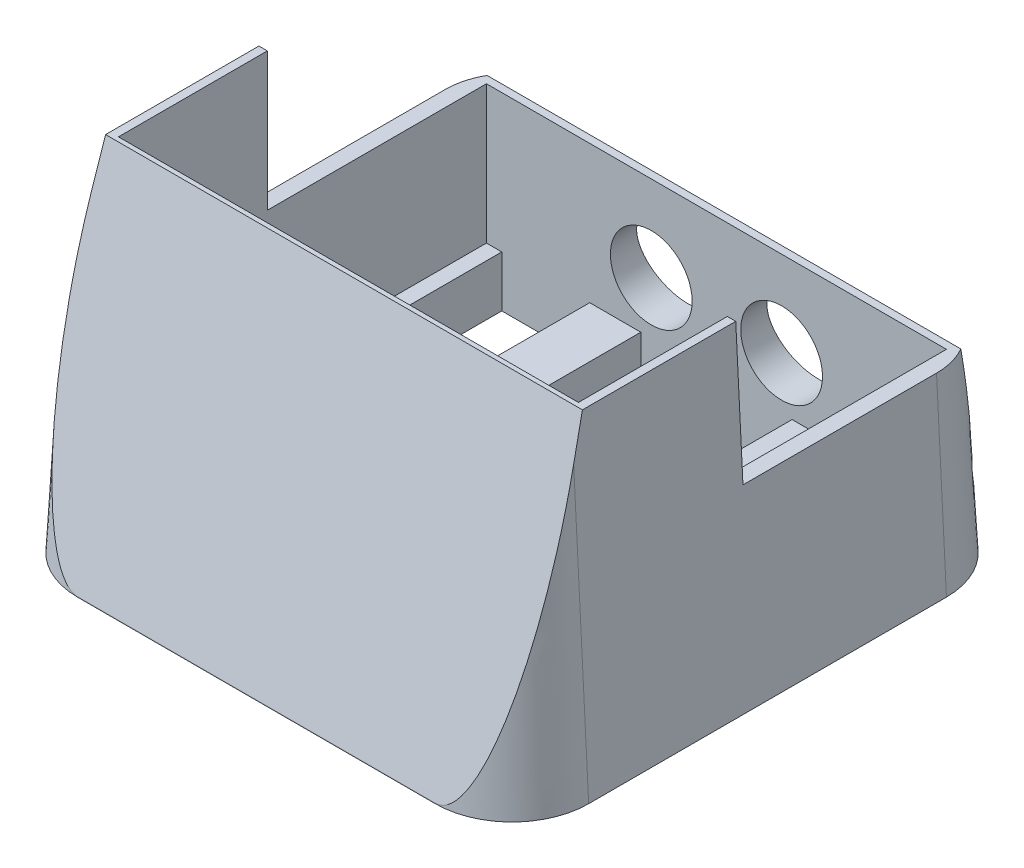
ISO-10303-21;
HEADER;
FILE_DESCRIPTION(('STEP AP214'),'2;1');
FILE_NAME('part.step','',(''),(''),'','','');
FILE_SCHEMA(('AUTOMOTIVE_DESIGN { 1 0 10303 214 1 1 1 1 }'));
ENDSEC;
DATA;
#1=APPLICATION_CONTEXT('core data for automotive mechanical design processes');
#2=APPLICATION_PROTOCOL_DEFINITION('international standard','automotive_design',2000,#1);
#3=PRODUCT_CONTEXT('',#1,'mechanical');
#4=PRODUCT('Part','Part','',(#3));
#5=PRODUCT_RELATED_PRODUCT_CATEGORY('part','',(#4));
#6=PRODUCT_DEFINITION_FORMATION('','',#4);
#7=PRODUCT_DEFINITION_CONTEXT('part definition',#1,'design');
#8=PRODUCT_DEFINITION('design','',#6,#7);
#9=PRODUCT_DEFINITION_SHAPE('','',#8);
#10=(LENGTH_UNIT() NAMED_UNIT(*) SI_UNIT(.MILLI.,.METRE.));
#11=(NAMED_UNIT(*) PLANE_ANGLE_UNIT() SI_UNIT($,.RADIAN.));
#12=(NAMED_UNIT(*) SI_UNIT($,.STERADIAN.) SOLID_ANGLE_UNIT());
#13=UNCERTAINTY_MEASURE_WITH_UNIT(LENGTH_MEASURE(1.E-05),#10,'distance_accuracy_value','');
#14=(GEOMETRIC_REPRESENTATION_CONTEXT(3) GLOBAL_UNCERTAINTY_ASSIGNED_CONTEXT((#13)) GLOBAL_UNIT_ASSIGNED_CONTEXT((#10,
#11,#12)) REPRESENTATION_CONTEXT('',''));
#15=CARTESIAN_POINT('',(0.,0.,0.));
#16=DIRECTION('',(0.,0.,1.));
#17=DIRECTION('',(1.,0.,0.));
#18=AXIS2_PLACEMENT_3D('',#15,#16,#17);
#19=CARTESIAN_POINT('',(-42.,0.,3.00000000000001));
#20=DIRECTION('',(0.,0.,1.));
#21=DIRECTION('',(1.,0.,0.));
#22=AXIS2_PLACEMENT_3D('',#19,#20,#21);
#23=PLANE('',#22);
#24=DIRECTION('',(0.,1.,0.));
#25=VECTOR('',#24,1.);
#26=CARTESIAN_POINT('',(-42.,0.,3.00000000000001));
#27=LINE('',#26,#25);
#28=CARTESIAN_POINT('',(-42.,0.,3.00000000000001));
#29=VERTEX_POINT('',#28);
#30=CARTESIAN_POINT('',(-42.,10.,3.00000000000001));
#31=VERTEX_POINT('',#30);
#32=EDGE_CURVE('E315',#29,#31,#27,.T.);
#33=ORIENTED_EDGE('',*,*,#32,.T.);
#34=DIRECTION('',(1.,0.,0.));
#35=VECTOR('',#34,1.);
#36=CARTESIAN_POINT('',(-42.,10.,3.00000000000001));
#37=LINE('',#36,#35);
#38=CARTESIAN_POINT('',(-24.8,10.,3.00000000000001));
#39=VERTEX_POINT('',#38);
#40=EDGE_CURVE('E579',#31,#39,#37,.T.);
#41=ORIENTED_EDGE('',*,*,#40,.T.);
#42=DIRECTION('',(0.,1.,0.));
#43=VECTOR('',#42,1.);
#44=CARTESIAN_POINT('',(-24.8,0.,3.00000000000001));
#45=LINE('',#44,#43);
#46=CARTESIAN_POINT('',(-24.8,0.,3.00000000000001));
#47=VERTEX_POINT('',#46);
#48=EDGE_CURVE('E311',#47,#39,#45,.T.);
#49=ORIENTED_EDGE('',*,*,#48,.F.);
#50=DIRECTION('',(1.,0.,0.));
#51=VECTOR('',#50,1.);
#52=CARTESIAN_POINT('',(-42.,0.,3.00000000000001));
#53=LINE('',#52,#51);
#54=EDGE_CURVE('E302',#29,#47,#53,.T.);
#55=ORIENTED_EDGE('',*,*,#54,.F.);
#56=EDGE_LOOP('',(#33,#41,#49,#55));
#57=FACE_BOUND('',#56,.T.);
#58=ADVANCED_FACE('F41',(#57),#23,.F.);
#59=DIRECTION('',(0.,-1.,0.));
#60=VECTOR('',#59,1.);
#61=CARTESIAN_POINT('',(-14.8,62.203065044114,3.00000000000001));
#62=LINE('',#61,#60);
#63=CARTESIAN_POINT('',(-14.8,10.,3.00000000000001));
#64=VERTEX_POINT('',#63);
#65=CARTESIAN_POINT('',(-14.8,2.5,3.00000000000001));
#66=VERTEX_POINT('',#65);
#67=EDGE_CURVE('E592',#64,#66,#62,.T.);
#68=ORIENTED_EDGE('',*,*,#67,.F.);
#69=CARTESIAN_POINT('',(14.8,10.,3.00000000000001));
#70=VERTEX_POINT('',#69);
#71=EDGE_CURVE('E581',#64,#70,#37,.T.);
#72=ORIENTED_EDGE('',*,*,#71,.T.);
#73=DIRECTION('',(0.,-1.,0.));
#74=VECTOR('',#73,1.);
#75=CARTESIAN_POINT('',(14.8,62.203065044114,3.00000000000001));
#76=LINE('',#75,#74);
#77=CARTESIAN_POINT('',(14.8,2.5,3.00000000000001));
#78=VERTEX_POINT('',#77);
#79=EDGE_CURVE('E590',#70,#78,#76,.T.);
#80=ORIENTED_EDGE('',*,*,#79,.T.);
#81=DIRECTION('',(-1.,0.,0.));
#82=VECTOR('',#81,1.);
#83=CARTESIAN_POINT('',(-14.8,2.5,3.00000000000001));
#84=LINE('',#83,#82);
#85=EDGE_CURVE('E613',#78,#66,#84,.T.);
#86=ORIENTED_EDGE('',*,*,#85,.T.);
#87=EDGE_LOOP('',(#68,#72,#80,#86));
#88=FACE_BOUND('',#87,.T.);
#89=ADVANCED_FACE('F548',(#88),#23,.F.);
#90=CARTESIAN_POINT('',(-42.,0.,-40.));
#91=DIRECTION('',(0.,0.,-1.));
#92=DIRECTION('',(-1.,0.,0.));
#93=AXIS2_PLACEMENT_3D('',#90,#91,#92);
#94=PLANE('',#93);
#95=DIRECTION('',(0.,1.,0.));
#96=VECTOR('',#95,1.);
#97=CARTESIAN_POINT('',(-24.8,0.,-40.));
#98=LINE('',#97,#96);
#99=CARTESIAN_POINT('',(-24.8,0.,-40.));
#100=VERTEX_POINT('',#99);
#101=CARTESIAN_POINT('',(-24.8,9.99999999999999,-40.));
#102=VERTEX_POINT('',#101);
#103=EDGE_CURVE('E305',#100,#102,#98,.T.);
#104=ORIENTED_EDGE('',*,*,#103,.T.);
#105=DIRECTION('',(-1.,0.,0.));
#106=VECTOR('',#105,1.);
#107=CARTESIAN_POINT('',(-45.,10.,-40.));
#108=LINE('',#107,#106);
#109=CARTESIAN_POINT('',(-14.8,10.,-40.));
#110=VERTEX_POINT('',#109);
#111=EDGE_CURVE('E632',#110,#102,#108,.T.);
#112=ORIENTED_EDGE('',*,*,#111,.F.);
#113=DIRECTION('',(0.,-1.,0.));
#114=VECTOR('',#113,1.);
#115=CARTESIAN_POINT('',(-14.8,62.203065044114,-40.));
#116=LINE('',#115,#114);
#117=CARTESIAN_POINT('',(-14.8,0.,-40.));
#118=VERTEX_POINT('',#117);
#119=EDGE_CURVE('E436',#110,#118,#116,.T.);
#120=ORIENTED_EDGE('',*,*,#119,.T.);
#121=DIRECTION('',(1.,0.,0.));
#122=VECTOR('',#121,1.);
#123=CARTESIAN_POINT('',(-14.8,0.,-40.));
#124=LINE('',#123,#122);
#125=CARTESIAN_POINT('',(14.8,0.,-40.));
#126=VERTEX_POINT('',#125);
#127=EDGE_CURVE('E604',#118,#126,#124,.T.);
#128=ORIENTED_EDGE('',*,*,#127,.T.);
#129=DIRECTION('',(0.,-1.,0.));
#130=VECTOR('',#129,1.);
#131=CARTESIAN_POINT('',(14.8,62.203065044114,-40.));
#132=LINE('',#131,#130);
#133=CARTESIAN_POINT('',(14.8,10.,-40.));
#134=VERTEX_POINT('',#133);
#135=EDGE_CURVE('E598',#134,#126,#132,.T.);
#136=ORIENTED_EDGE('',*,*,#135,.F.);
#137=CARTESIAN_POINT('',(24.8,9.99999999999999,-40.));
#138=VERTEX_POINT('',#137);
#139=EDGE_CURVE('E289',#138,#134,#108,.T.);
#140=ORIENTED_EDGE('',*,*,#139,.F.);
#141=DIRECTION('',(0.,1.,0.));
#142=VECTOR('',#141,1.);
#143=CARTESIAN_POINT('',(24.8,0.,-40.));
#144=LINE('',#143,#142);
#145=CARTESIAN_POINT('',(24.8,0.,-40.));
#146=VERTEX_POINT('',#145);
#147=EDGE_CURVE('E327',#146,#138,#144,.T.);
#148=ORIENTED_EDGE('',*,*,#147,.F.);
#149=DIRECTION('',(-1.,0.,0.));
#150=VECTOR('',#149,1.);
#151=CARTESIAN_POINT('',(24.8,0.,-40.));
#152=LINE('',#151,#150);
#153=CARTESIAN_POINT('',(42.,0.,-40.));
#154=VERTEX_POINT('',#153);
#155=EDGE_CURVE('E345',#154,#146,#152,.T.);
#156=ORIENTED_EDGE('',*,*,#155,.F.);
#157=DIRECTION('',(0.,1.,0.));
#158=VECTOR('',#157,1.);
#159=CARTESIAN_POINT('',(42.,0.,-40.));
#160=LINE('',#159,#158);
#161=CARTESIAN_POINT('',(42.,10.,-40.));
#162=VERTEX_POINT('',#161);
#163=EDGE_CURVE('E323',#154,#162,#160,.T.);
#164=ORIENTED_EDGE('',*,*,#163,.T.);
#165=CARTESIAN_POINT('',(45.,10.,-40.));
#166=VERTEX_POINT('',#165);
#167=EDGE_CURVE('E286',#166,#162,#108,.T.);
#168=ORIENTED_EDGE('',*,*,#167,.F.);
#169=DIRECTION('',(0.,-1.,0.));
#170=VECTOR('',#169,1.);
#171=CARTESIAN_POINT('',(45.,166.42135623731,-40.));
#172=LINE('',#171,#170);
#173=CARTESIAN_POINT('',(45.,37.,-40.));
#174=VERTEX_POINT('',#173);
#175=EDGE_CURVE('E264',#174,#166,#172,.T.);
#176=ORIENTED_EDGE('',*,*,#175,.F.);
#177=DIRECTION('',(-1.,0.,0.));
#178=VECTOR('',#177,1.);
#179=CARTESIAN_POINT('',(-42.,37.,-40.));
#180=LINE('',#179,#178);
#181=CARTESIAN_POINT('',(-45.,37.,-40.));
#182=VERTEX_POINT('',#181);
#183=EDGE_CURVE('E457',#174,#182,#180,.T.);
#184=ORIENTED_EDGE('',*,*,#183,.T.);
#185=DIRECTION('',(0.,-1.,0.));
#186=VECTOR('',#185,1.);
#187=CARTESIAN_POINT('',(-45.,166.42135623731,-40.));
#188=LINE('',#187,#186);
#189=CARTESIAN_POINT('',(-45.,10.,-40.));
#190=VERTEX_POINT('',#189);
#191=EDGE_CURVE('E288',#182,#190,#188,.T.);
#192=ORIENTED_EDGE('',*,*,#191,.T.);
#193=CARTESIAN_POINT('',(-42.,10.,-40.));
#194=VERTEX_POINT('',#193);
#195=EDGE_CURVE('E274',#194,#190,#108,.T.);
#196=ORIENTED_EDGE('',*,*,#195,.F.);
#197=DIRECTION('',(0.,1.,0.));
#198=VECTOR('',#197,1.);
#199=CARTESIAN_POINT('',(-42.,0.,-40.));
#200=LINE('',#199,#198);
#201=CARTESIAN_POINT('',(-42.,0.,-40.));
#202=VERTEX_POINT('',#201);
#203=EDGE_CURVE('E318',#202,#194,#200,.T.);
#204=ORIENTED_EDGE('',*,*,#203,.F.);
#205=DIRECTION('',(-1.,0.,0.));
#206=VECTOR('',#205,1.);
#207=CARTESIAN_POINT('',(-42.,0.,-40.));
#208=LINE('',#207,#206);
#209=EDGE_CURVE('E295',#100,#202,#208,.T.);
#210=ORIENTED_EDGE('',*,*,#209,.F.);
#211=EDGE_LOOP('',(#104,#112,#120,#128,#136,#140,#148,#156,#164,#168,#176,#184,#192,#196,#204,#210));
#212=FACE_BOUND('',#211,.T.);
#213=CARTESIAN_POINT('',(12.75,20.25,-40.));
#214=DIRECTION('',(0.,0.,1.));
#215=DIRECTION('',(1.,0.,0.));
#216=AXIS2_PLACEMENT_3D('',#213,#214,#215);
#217=CIRCLE('',#216,8.);
#218=CARTESIAN_POINT('',(20.75,20.25,-40.));
#219=VERTEX_POINT('',#218);
#220=EDGE_CURVE('E428',#219,#219,#217,.T.);
#221=ORIENTED_EDGE('',*,*,#220,.F.);
#222=EDGE_LOOP('',(#221));
#223=FACE_BOUND('',#222,.T.);
#224=CARTESIAN_POINT('',(-12.75,20.25,-40.));
#225=DIRECTION('',(0.,0.,1.));
#226=DIRECTION('',(1.,0.,0.));
#227=AXIS2_PLACEMENT_3D('',#224,#225,#226);
#228=CIRCLE('',#227,8.);
#229=CARTESIAN_POINT('',(-4.75,20.25,-40.));
#230=VERTEX_POINT('',#229);
#231=EDGE_CURVE('E422',#230,#230,#228,.T.);
#232=ORIENTED_EDGE('',*,*,#231,.F.);
#233=EDGE_LOOP('',(#232));
#234=FACE_BOUND('',#233,.T.);
#235=ADVANCED_FACE('F555',(#212,#223,#234),#94,.F.);
#236=DIRECTION('',(0.,1.,0.));
#237=VECTOR('',#236,1.);
#238=CARTESIAN_POINT('',(24.8,0.,3.00000000000001));
#239=LINE('',#238,#237);
#240=CARTESIAN_POINT('',(24.8,0.,3.00000000000001));
#241=VERTEX_POINT('',#240);
#242=CARTESIAN_POINT('',(24.8,10.,3.00000000000001));
#243=VERTEX_POINT('',#242);
#244=EDGE_CURVE('E330',#241,#243,#239,.T.);
#245=ORIENTED_EDGE('',*,*,#244,.T.);
#246=CARTESIAN_POINT('',(42.,10.,3.00000000000001));
#247=VERTEX_POINT('',#246);
#248=EDGE_CURVE('E572',#243,#247,#37,.T.);
#249=ORIENTED_EDGE('',*,*,#248,.T.);
#250=DIRECTION('',(0.,1.,0.));
#251=VECTOR('',#250,1.);
#252=CARTESIAN_POINT('',(42.,0.,3.00000000000001));
#253=LINE('',#252,#251);
#254=CARTESIAN_POINT('',(42.,0.,3.00000000000001));
#255=VERTEX_POINT('',#254);
#256=EDGE_CURVE('E263',#255,#247,#253,.T.);
#257=ORIENTED_EDGE('',*,*,#256,.F.);
#258=DIRECTION('',(1.,0.,0.));
#259=VECTOR('',#258,1.);
#260=CARTESIAN_POINT('',(24.8,0.,3.00000000000001));
#261=LINE('',#260,#259);
#262=EDGE_CURVE('E326',#241,#255,#261,.T.);
#263=ORIENTED_EDGE('',*,*,#262,.F.);
#264=EDGE_LOOP('',(#245,#249,#257,#263));
#265=FACE_BOUND('',#264,.T.);
#266=ADVANCED_FACE('F551',(#265),#23,.F.);
#267=CARTESIAN_POINT('',(-35.,0.,-35.));
#268=DIRECTION('',(0.,-1.,0.));
#269=DIRECTION('',(0.,0.,-1.));
#270=AXIS2_PLACEMENT_3D('',#267,#268,#269);
#271=PLANE('',#270);
#272=DIRECTION('',(0.,0.,-1.));
#273=VECTOR('',#272,1.);
#274=CARTESIAN_POINT('',(-14.8,0.,-40.));
#275=LINE('',#274,#273);
#276=CARTESIAN_POINT('',(-14.8,0.,-30.));
#277=VERTEX_POINT('',#276);
#278=EDGE_CURVE('E607',#277,#118,#275,.T.);
#279=ORIENTED_EDGE('',*,*,#278,.F.);
#280=DIRECTION('',(1.,0.,0.));
#281=VECTOR('',#280,1.);
#282=CARTESIAN_POINT('',(-14.8,0.,-30.));
#283=LINE('',#282,#281);
#284=CARTESIAN_POINT('',(14.8,0.,-30.));
#285=VERTEX_POINT('',#284);
#286=EDGE_CURVE('E578',#277,#285,#283,.T.);
#287=ORIENTED_EDGE('',*,*,#286,.T.);
#288=DIRECTION('',(0.,0.,1.));
#289=VECTOR('',#288,1.);
#290=CARTESIAN_POINT('',(14.8,0.,-40.));
#291=LINE('',#290,#289);
#292=EDGE_CURVE('E602',#126,#285,#291,.T.);
#293=ORIENTED_EDGE('',*,*,#292,.F.);
#294=ORIENTED_EDGE('',*,*,#127,.F.);
#295=EDGE_LOOP('',(#279,#287,#293,#294));
#296=FACE_BOUND('',#295,.T.);
#297=DIRECTION('',(0.,0.,-1.));
#298=VECTOR('',#297,1.);
#299=CARTESIAN_POINT('',(-24.8,0.,-40.));
#300=LINE('',#299,#298);
#301=EDGE_CURVE('E292',#47,#100,#300,.T.);
#302=ORIENTED_EDGE('',*,*,#301,.T.);
#303=ORIENTED_EDGE('',*,*,#209,.T.);
#304=DIRECTION('',(0.,0.,1.));
#305=VECTOR('',#304,1.);
#306=CARTESIAN_POINT('',(-42.,0.,-40.));
#307=LINE('',#306,#305);
#308=EDGE_CURVE('E299',#202,#29,#307,.T.);
#309=ORIENTED_EDGE('',*,*,#308,.T.);
#310=ORIENTED_EDGE('',*,*,#54,.T.);
#311=EDGE_LOOP('',(#302,#303,#309,#310));
#312=FACE_BOUND('',#311,.T.);
#313=DIRECTION('',(0.,0.,-1.));
#314=VECTOR('',#313,1.);
#315=CARTESIAN_POINT('',(42.,0.,-40.));
#316=LINE('',#315,#314);
#317=EDGE_CURVE('E337',#255,#154,#316,.T.);
#318=ORIENTED_EDGE('',*,*,#317,.T.);
#319=ORIENTED_EDGE('',*,*,#155,.T.);
#320=DIRECTION('',(0.,0.,1.));
#321=VECTOR('',#320,1.);
#322=CARTESIAN_POINT('',(24.8,0.,-40.));
#323=LINE('',#322,#321);
#324=EDGE_CURVE('E342',#146,#241,#323,.T.);
#325=ORIENTED_EDGE('',*,*,#324,.T.);
#326=ORIENTED_EDGE('',*,*,#262,.T.);
#327=EDGE_LOOP('',(#318,#319,#325,#326));
#328=FACE_BOUND('',#327,.T.);
#329=CARTESIAN_POINT('',(-35.,0.,-35.));
#330=DIRECTION('',(0.,1.,0.));
#331=DIRECTION('',(0.,0.,-1.));
#332=AXIS2_PLACEMENT_3D('',#329,#330,#331);
#333=CIRCLE('',#332,15.);
#334=CARTESIAN_POINT('',(-35.,0.,-50.));
#335=VERTEX_POINT('',#334);
#336=CARTESIAN_POINT('',(-50.,0.,-35.));
#337=VERTEX_POINT('',#336);
#338=EDGE_CURVE('E314',#335,#337,#333,.T.);
#339=ORIENTED_EDGE('',*,*,#338,.F.);
#340=DIRECTION('',(-1.,0.,0.));
#341=VECTOR('',#340,1.);
#342=CARTESIAN_POINT('',(-35.,0.,-50.));
#343=LINE('',#342,#341);
#344=CARTESIAN_POINT('',(35.,0.,-50.));
#345=VERTEX_POINT('',#344);
#346=EDGE_CURVE('E370',#345,#335,#343,.T.);
#347=ORIENTED_EDGE('',*,*,#346,.F.);
#348=CARTESIAN_POINT('',(35.,0.,-35.));
#349=DIRECTION('',(0.,1.,0.));
#350=DIRECTION('',(0.,0.,-1.));
#351=AXIS2_PLACEMENT_3D('',#348,#349,#350);
#352=CIRCLE('',#351,15.);
#353=CARTESIAN_POINT('',(50.,0.,-35.));
#354=VERTEX_POINT('',#353);
#355=EDGE_CURVE('E367',#354,#345,#352,.T.);
#356=ORIENTED_EDGE('',*,*,#355,.F.);
#357=DIRECTION('',(0.,0.,-1.));
#358=VECTOR('',#357,1.);
#359=CARTESIAN_POINT('',(50.,0.,-35.));
#360=LINE('',#359,#358);
#361=CARTESIAN_POINT('',(50.,0.,35.));
#362=VERTEX_POINT('',#361);
#363=EDGE_CURVE('E364',#362,#354,#360,.T.);
#364=ORIENTED_EDGE('',*,*,#363,.F.);
#365=CARTESIAN_POINT('',(35.,0.,35.));
#366=DIRECTION('',(0.,1.,0.));
#367=DIRECTION('',(0.,0.,1.));
#368=AXIS2_PLACEMENT_3D('',#365,#366,#367);
#369=CIRCLE('',#368,15.);
#370=CARTESIAN_POINT('',(35.,0.,50.));
#371=VERTEX_POINT('',#370);
#372=EDGE_CURVE('E361',#371,#362,#369,.T.);
#373=ORIENTED_EDGE('',*,*,#372,.F.);
#374=DIRECTION('',(1.,0.,0.));
#375=VECTOR('',#374,1.);
#376=CARTESIAN_POINT('',(-35.,0.,50.));
#377=LINE('',#376,#375);
#378=CARTESIAN_POINT('',(-35.,0.,50.));
#379=VERTEX_POINT('',#378);
#380=EDGE_CURVE('E358',#379,#371,#377,.T.);
#381=ORIENTED_EDGE('',*,*,#380,.F.);
#382=CARTESIAN_POINT('',(-35.,0.,35.));
#383=DIRECTION('',(0.,1.,0.));
#384=DIRECTION('',(0.,0.,1.));
#385=AXIS2_PLACEMENT_3D('',#382,#383,#384);
#386=CIRCLE('',#385,15.);
#387=CARTESIAN_POINT('',(-50.,0.,35.));
#388=VERTEX_POINT('',#387);
#389=EDGE_CURVE('E355',#388,#379,#386,.T.);
#390=ORIENTED_EDGE('',*,*,#389,.F.);
#391=DIRECTION('',(0.,0.,1.));
#392=VECTOR('',#391,1.);
#393=CARTESIAN_POINT('',(-50.,0.,-35.));
#394=LINE('',#393,#392);
#395=EDGE_CURVE('E352',#337,#388,#394,.T.);
#396=ORIENTED_EDGE('',*,*,#395,.F.);
#397=EDGE_LOOP('',(#339,#347,#356,#364,#373,#381,#390,#396));
#398=FACE_BOUND('',#397,.T.);
#399=ADVANCED_FACE('F511',(#296,#312,#328,#398),#271,.T.);
#400=CARTESIAN_POINT('',(42.,0.,-40.));
#401=DIRECTION('',(1.,0.,0.));
#402=DIRECTION('',(0.,0.,-1.));
#403=AXIS2_PLACEMENT_3D('',#400,#401,#402);
#404=PLANE('',#403);
#405=DIRECTION('',(0.,0.,-1.));
#406=VECTOR('',#405,1.);
#407=CARTESIAN_POINT('',(42.,10.,-40.));
#408=LINE('',#407,#406);
#409=EDGE_CURVE('E308',#247,#162,#408,.T.);
#410=ORIENTED_EDGE('',*,*,#409,.T.);
#411=ORIENTED_EDGE('',*,*,#163,.F.);
#412=ORIENTED_EDGE('',*,*,#317,.F.);
#413=ORIENTED_EDGE('',*,*,#256,.T.);
#414=EDGE_LOOP('',(#410,#411,#412,#413));
#415=FACE_BOUND('',#414,.T.);
#416=ADVANCED_FACE('F565',(#415),#404,.F.);
#417=CARTESIAN_POINT('',(24.8,0.,-40.));
#418=DIRECTION('',(-1.,0.,0.));
#419=DIRECTION('',(0.,0.,1.));
#420=AXIS2_PLACEMENT_3D('',#417,#418,#419);
#421=PLANE('',#420);
#422=ORIENTED_EDGE('',*,*,#147,.T.);
#423=DIRECTION('',(0.,0.,1.));
#424=VECTOR('',#423,1.);
#425=CARTESIAN_POINT('',(24.8,10.,-40.));
#426=LINE('',#425,#424);
#427=EDGE_CURVE('E335',#138,#243,#426,.T.);
#428=ORIENTED_EDGE('',*,*,#427,.T.);
#429=ORIENTED_EDGE('',*,*,#244,.F.);
#430=ORIENTED_EDGE('',*,*,#324,.F.);
#431=EDGE_LOOP('',(#422,#428,#429,#430));
#432=FACE_BOUND('',#431,.T.);
#433=ADVANCED_FACE('F574',(#432),#421,.F.);
#434=CARTESIAN_POINT('',(-24.8,0.,-40.));
#435=DIRECTION('',(1.,0.,0.));
#436=DIRECTION('',(0.,0.,-1.));
#437=AXIS2_PLACEMENT_3D('',#434,#435,#436);
#438=PLANE('',#437);
#439=DIRECTION('',(0.,0.,-1.));
#440=VECTOR('',#439,1.);
#441=CARTESIAN_POINT('',(-24.8,10.,-40.));
#442=LINE('',#441,#440);
#443=EDGE_CURVE('E306',#39,#102,#442,.T.);
#444=ORIENTED_EDGE('',*,*,#443,.T.);
#445=ORIENTED_EDGE('',*,*,#103,.F.);
#446=ORIENTED_EDGE('',*,*,#301,.F.);
#447=ORIENTED_EDGE('',*,*,#48,.T.);
#448=EDGE_LOOP('',(#444,#445,#446,#447));
#449=FACE_BOUND('',#448,.T.);
#450=ADVANCED_FACE('F638',(#449),#438,.F.);
#451=CARTESIAN_POINT('',(-42.,0.,-40.));
#452=DIRECTION('',(-1.,0.,0.));
#453=DIRECTION('',(0.,0.,1.));
#454=AXIS2_PLACEMENT_3D('',#451,#452,#453);
#455=PLANE('',#454);
#456=DIRECTION('',(0.,0.,1.));
#457=VECTOR('',#456,1.);
#458=CARTESIAN_POINT('',(-42.,10.,-40.));
#459=LINE('',#458,#457);
#460=EDGE_CURVE('E296',#194,#31,#459,.T.);
#461=ORIENTED_EDGE('',*,*,#460,.T.);
#462=ORIENTED_EDGE('',*,*,#32,.F.);
#463=ORIENTED_EDGE('',*,*,#308,.F.);
#464=ORIENTED_EDGE('',*,*,#203,.T.);
#465=EDGE_LOOP('',(#461,#462,#463,#464));
#466=FACE_BOUND('',#465,.T.);
#467=ADVANCED_FACE('F642',(#466),#455,.F.);
#468=CARTESIAN_POINT('',(-40.,25.,32.));
#469=DIRECTION('',(0.,0.,-1.));
#470=DIRECTION('',(-1.,0.,0.));
#471=AXIS2_PLACEMENT_3D('',#468,#469,#470);
#472=PLANE('',#471);
#473=DIRECTION('',(0.,-1.,0.));
#474=VECTOR('',#473,1.);
#475=CARTESIAN_POINT('',(45.,64.,32.));
#476=LINE('',#475,#474);
#477=CARTESIAN_POINT('',(45.,64.,32.));
#478=VERTEX_POINT('',#477);
#479=CARTESIAN_POINT('',(45.,9.99999999999999,32.));
#480=VERTEX_POINT('',#479);
#481=EDGE_CURVE('E270',#478,#480,#476,.T.);
#482=ORIENTED_EDGE('',*,*,#481,.T.);
#483=DIRECTION('',(1.,0.,0.));
#484=VECTOR('',#483,1.);
#485=CARTESIAN_POINT('',(-40.,10.,32.));
#486=LINE('',#485,#484);
#487=CARTESIAN_POINT('',(-45.,9.99999999999999,32.));
#488=VERTEX_POINT('',#487);
#489=EDGE_CURVE('E251',#488,#480,#486,.T.);
#490=ORIENTED_EDGE('',*,*,#489,.F.);
#491=DIRECTION('',(0.,-1.,0.));
#492=VECTOR('',#491,1.);
#493=CARTESIAN_POINT('',(-45.,64.,32.));
#494=LINE('',#493,#492);
#495=CARTESIAN_POINT('',(-45.,64.,32.));
#496=VERTEX_POINT('',#495);
#497=EDGE_CURVE('E279',#496,#488,#494,.T.);
#498=ORIENTED_EDGE('',*,*,#497,.F.);
#499=DIRECTION('',(1.,0.,0.));
#500=VECTOR('',#499,1.);
#501=CARTESIAN_POINT('',(45.,64.,32.));
#502=LINE('',#501,#500);
#503=EDGE_CURVE('E278',#496,#478,#502,.T.);
#504=ORIENTED_EDGE('',*,*,#503,.T.);
#505=EDGE_LOOP('',(#482,#490,#498,#504));
#506=FACE_BOUND('',#505,.T.);
#507=ADVANCED_FACE('F276',(#506),#472,.T.);
#508=CARTESIAN_POINT('',(-35.,10.,-35.));
#509=DIRECTION('',(0.,-1.,0.));
#510=DIRECTION('',(0.,0.,-1.));
#511=AXIS2_PLACEMENT_3D('',#508,#509,#510);
#512=PLANE('',#511);
#513=ORIENTED_EDGE('',*,*,#139,.T.);
#514=DIRECTION('',(0.,0.,-1.));
#515=VECTOR('',#514,1.);
#516=CARTESIAN_POINT('',(14.8,10.,-40.));
#517=LINE('',#516,#515);
#518=EDGE_CURVE('E595',#70,#134,#517,.T.);
#519=ORIENTED_EDGE('',*,*,#518,.F.);
#520=ORIENTED_EDGE('',*,*,#71,.F.);
#521=DIRECTION('',(0.,0.,1.));
#522=VECTOR('',#521,1.);
#523=CARTESIAN_POINT('',(-14.8,10.,-40.));
#524=LINE('',#523,#522);
#525=EDGE_CURVE('E433',#110,#64,#524,.T.);
#526=ORIENTED_EDGE('',*,*,#525,.F.);
#527=ORIENTED_EDGE('',*,*,#111,.T.);
#528=ORIENTED_EDGE('',*,*,#443,.F.);
#529=ORIENTED_EDGE('',*,*,#40,.F.);
#530=ORIENTED_EDGE('',*,*,#460,.F.);
#531=ORIENTED_EDGE('',*,*,#195,.T.);
#532=DIRECTION('',(0.,0.,1.));
#533=VECTOR('',#532,1.);
#534=CARTESIAN_POINT('',(-45.,10.,37.));
#535=LINE('',#534,#533);
#536=EDGE_CURVE('E258',#190,#488,#535,.T.);
#537=ORIENTED_EDGE('',*,*,#536,.T.);
#538=ORIENTED_EDGE('',*,*,#489,.T.);
#539=DIRECTION('',(0.,0.,-1.));
#540=VECTOR('',#539,1.);
#541=CARTESIAN_POINT('',(45.,10.,37.));
#542=LINE('',#541,#540);
#543=EDGE_CURVE('E255',#480,#166,#542,.T.);
#544=ORIENTED_EDGE('',*,*,#543,.T.);
#545=ORIENTED_EDGE('',*,*,#167,.T.);
#546=ORIENTED_EDGE('',*,*,#409,.F.);
#547=ORIENTED_EDGE('',*,*,#248,.F.);
#548=ORIENTED_EDGE('',*,*,#427,.F.);
#549=EDGE_LOOP('',(#513,#519,#520,#526,#527,#528,#529,#530,#531,#537,#538,#544,#545,#546,#547,#548));
#550=FACE_BOUND('',#549,.T.);
#551=ADVANCED_FACE('F254',(#550),#512,.F.);
#552=CARTESIAN_POINT('',(45.,166.42135623731,37.));
#553=DIRECTION('',(-1.,0.,0.));
#554=DIRECTION('',(0.,0.,1.));
#555=AXIS2_PLACEMENT_3D('',#552,#553,#554);
#556=PLANE('',#555);
#557=ORIENTED_EDGE('',*,*,#543,.F.);
#558=ORIENTED_EDGE('',*,*,#481,.F.);
#559=DIRECTION('',(0.,0.,-1.));
#560=VECTOR('',#559,1.);
#561=CARTESIAN_POINT('',(45.,64.,32.));
#562=LINE('',#561,#560);
#563=CARTESIAN_POINT('',(45.,64.,2.87015677341087));
#564=VERTEX_POINT('',#563);
#565=EDGE_CURVE('E468',#478,#564,#562,.T.);
#566=ORIENTED_EDGE('',*,*,#565,.T.);
#567=DIRECTION('',(0.,1.,0.));
#568=VECTOR('',#567,1.);
#569=CARTESIAN_POINT('',(45.,166.42135623731,2.87015677341086));
#570=LINE('',#569,#568);
#571=CARTESIAN_POINT('',(45.,37.,2.87015677341087));
#572=VERTEX_POINT('',#571);
#573=EDGE_CURVE('E383',#572,#564,#570,.T.);
#574=ORIENTED_EDGE('',*,*,#573,.F.);
#575=DIRECTION('',(0.,0.,1.));
#576=VECTOR('',#575,1.);
#577=CARTESIAN_POINT('',(45.,37.,37.));
#578=LINE('',#577,#576);
#579=EDGE_CURVE('E460',#174,#572,#578,.T.);
#580=ORIENTED_EDGE('',*,*,#579,.F.);
#581=ORIENTED_EDGE('',*,*,#175,.T.);
#582=EDGE_LOOP('',(#557,#558,#566,#574,#580,#581));
#583=FACE_BOUND('',#582,.T.);
#584=ADVANCED_FACE('F268',(#583),#556,.T.);
#585=CARTESIAN_POINT('',(-45.,166.42135623731,37.));
#586=DIRECTION('',(1.,0.,0.));
#587=DIRECTION('',(0.,0.,-1.));
#588=AXIS2_PLACEMENT_3D('',#585,#586,#587);
#589=PLANE('',#588);
#590=ORIENTED_EDGE('',*,*,#497,.T.);
#591=ORIENTED_EDGE('',*,*,#536,.F.);
#592=ORIENTED_EDGE('',*,*,#191,.F.);
#593=DIRECTION('',(0.,0.,-1.));
#594=VECTOR('',#593,1.);
#595=CARTESIAN_POINT('',(-45.,37.,37.));
#596=LINE('',#595,#594);
#597=CARTESIAN_POINT('',(-45.,37.,2.87015677341087));
#598=VERTEX_POINT('',#597);
#599=EDGE_CURVE('E454',#598,#182,#596,.T.);
#600=ORIENTED_EDGE('',*,*,#599,.F.);
#601=DIRECTION('',(0.,-1.,0.));
#602=VECTOR('',#601,1.);
#603=CARTESIAN_POINT('',(-45.,166.42135623731,2.87015677341086));
#604=LINE('',#603,#602);
#605=CARTESIAN_POINT('',(-45.,64.,2.87015677341087));
#606=VERTEX_POINT('',#605);
#607=EDGE_CURVE('E464',#606,#598,#604,.T.);
#608=ORIENTED_EDGE('',*,*,#607,.F.);
#609=DIRECTION('',(0.,0.,1.));
#610=VECTOR('',#609,1.);
#611=CARTESIAN_POINT('',(-45.,64.,-35.));
#612=LINE('',#611,#610);
#613=EDGE_CURVE('E282',#606,#496,#612,.T.);
#614=ORIENTED_EDGE('',*,*,#613,.T.);
#615=EDGE_LOOP('',(#590,#591,#592,#600,#608,#614));
#616=FACE_BOUND('',#615,.T.);
#617=ADVANCED_FACE('F472',(#616),#589,.T.);
#618=CARTESIAN_POINT('',(-35.,64.,-35.));
#619=DIRECTION('',(0.,1.,0.));
#620=DIRECTION('',(0.,0.,1.));
#621=AXIS2_PLACEMENT_3D('',#618,#619,#620);
#622=PLANE('',#621);
#623=DIRECTION('',(-1.,0.,0.));
#624=VECTOR('',#623,1.);
#625=CARTESIAN_POINT('',(50.,64.,2.87015677341087));
#626=LINE('',#625,#624);
#627=CARTESIAN_POINT('',(-46.6459021258853,64.,2.87015677341087));
#628=VERTEX_POINT('',#627);
#629=EDGE_CURVE('E426',#606,#628,#626,.T.);
#630=ORIENTED_EDGE('',*,*,#629,.T.);
#631=DIRECTION('',(0.,0.,1.));
#632=VECTOR('',#631,1.);
#633=CARTESIAN_POINT('',(-46.6459021258853,64.,35.));
#634=LINE('',#633,#632);
#635=CARTESIAN_POINT('',(-46.6459021258853,64.,32.8701567734109));
#636=VERTEX_POINT('',#635);
#637=EDGE_CURVE('E373',#628,#636,#634,.T.);
#638=ORIENTED_EDGE('',*,*,#637,.T.);
#639=DIRECTION('',(1.,0.,0.));
#640=VECTOR('',#639,1.);
#641=CARTESIAN_POINT('',(-35.,64.,32.8701567734109));
#642=LINE('',#641,#640);
#643=CARTESIAN_POINT('',(46.6459021258853,64.,32.8701567734109));
#644=VERTEX_POINT('',#643);
#645=EDGE_CURVE('E406',#636,#644,#642,.T.);
#646=ORIENTED_EDGE('',*,*,#645,.T.);
#647=DIRECTION('',(0.,0.,-1.));
#648=VECTOR('',#647,1.);
#649=CARTESIAN_POINT('',(46.6459021258853,64.,-35.));
#650=LINE('',#649,#648);
#651=CARTESIAN_POINT('',(46.6459021258853,64.,2.87015677341087));
#652=VERTEX_POINT('',#651);
#653=EDGE_CURVE('E375',#644,#652,#650,.T.);
#654=ORIENTED_EDGE('',*,*,#653,.T.);
#655=EDGE_CURVE('E443',#652,#564,#626,.T.);
#656=ORIENTED_EDGE('',*,*,#655,.T.);
#657=ORIENTED_EDGE('',*,*,#565,.F.);
#658=ORIENTED_EDGE('',*,*,#503,.F.);
#659=ORIENTED_EDGE('',*,*,#613,.F.);
#660=EDGE_LOOP('',(#630,#638,#646,#654,#656,#657,#658,#659));
#661=FACE_BOUND('',#660,.T.);
#662=ADVANCED_FACE('F475',(#661),#622,.T.);
#663=CARTESIAN_POINT('',(-35.,64.,-46.6459021258853));
#664=DIRECTION('',(0.,0.0523359562429415,-0.998629534754574));
#665=DIRECTION('',(1.,0.,0.));
#666=AXIS2_PLACEMENT_3D('',#663,#664,#665);
#667=PLANE('',#666);
#668=DIRECTION('',(0.,-0.998629534754574,-0.0523359562429415));
#669=VECTOR('',#668,1.);
#670=CARTESIAN_POINT('',(-35.,64.,-46.6459021258853));
#671=LINE('',#670,#669);
#672=CARTESIAN_POINT('',(-35.,0.0877097757071843,-49.9954033254335));
#673=VERTEX_POINT('',#672);
#674=EDGE_CURVE('E398',#673,#335,#671,.T.);
#675=ORIENTED_EDGE('',*,*,#674,.F.);
#676=DIRECTION('',(1.,0.,0.));
#677=VECTOR('',#676,1.);
#678=CARTESIAN_POINT('',(-35.,0.0877097757071704,-49.9954033254335));
#679=LINE('',#678,#677);
#680=CARTESIAN_POINT('',(35.,0.0877097757071803,-49.9954033254335));
#681=VERTEX_POINT('',#680);
#682=EDGE_CURVE('E401',#673,#681,#679,.T.);
#683=ORIENTED_EDGE('',*,*,#682,.T.);
#684=DIRECTION('',(0.,0.998629534754574,0.0523359562429415));
#685=VECTOR('',#684,1.);
#686=CARTESIAN_POINT('',(35.,-4.19109191795997E-12,-50.));
#687=LINE('',#686,#685);
#688=EDGE_CURVE('E395',#345,#681,#687,.T.);
#689=ORIENTED_EDGE('',*,*,#688,.F.);
#690=ORIENTED_EDGE('',*,*,#346,.T.);
#691=EDGE_LOOP('',(#675,#683,#689,#690));
#692=FACE_BOUND('',#691,.T.);
#693=ADVANCED_FACE('F508',(#692),#667,.T.);
#694=CARTESIAN_POINT('',(-35.,64.,-35.));
#695=DIRECTION('',(0.,-1.,0.));
#696=DIRECTION('',(0.,0.,-1.));
#697=AXIS2_PLACEMENT_3D('',#694,#695,#696);
#698=CONICAL_SURFACE('',#697,11.6459021258853,0.0523598775598275);
#699=CARTESIAN_POINT('',(-35.,37.,-35.));
#700=DIRECTION('',(0.,-1.,0.));
#701=DIRECTION('',(0.,0.,-1.));
#702=AXIS2_PLACEMENT_3D('',#699,#700,#701);
#703=CIRCLE('',#702,13.0609121665274);
#704=CARTESIAN_POINT('',(-46.3437577759194,37.,-41.4735296510491));
#705=VERTEX_POINT('',#704);
#706=CARTESIAN_POINT('',(-48.0609121665273,37.,-35.));
#707=VERTEX_POINT('',#706);
#708=EDGE_CURVE('E448',#705,#707,#703,.F.);
#709=ORIENTED_EDGE('',*,*,#708,.F.);
#710=CARTESIAN_POINT('',(-35.,53.0233799061586,-37.7742409163965));
#711=DIRECTION('',(0.,-0.22495105434387,0.974370064785234));
#712=DIRECTION('',(0.,-0.974370064785234,-0.22495105434387));
#713=AXIS2_PLACEMENT_3D('',#710,#711,#712);
#714=ELLIPSE('',#713,54.3280957036788,11.9021173732179);
#715=EDGE_CURVE('E378',#705,#673,#714,.T.);
#716=ORIENTED_EDGE('',*,*,#715,.T.);
#717=ORIENTED_EDGE('',*,*,#674,.T.);
#718=ORIENTED_EDGE('',*,*,#338,.T.);
#719=DIRECTION('',(-0.0523359562429415,-0.998629534754574,0.));
#720=VECTOR('',#719,1.);
#721=CARTESIAN_POINT('',(-46.6459021258853,64.,-35.));
#722=LINE('',#721,#720);
#723=EDGE_CURVE('E393',#707,#337,#722,.T.);
#724=ORIENTED_EDGE('',*,*,#723,.F.);
#725=EDGE_LOOP('',(#709,#716,#717,#718,#724));
#726=FACE_BOUND('',#725,.T.);
#727=ADVANCED_FACE('F504',(#726),#698,.T.);
#728=CARTESIAN_POINT('',(35.,64.,-35.));
#729=DIRECTION('',(0.,-1.,0.));
#730=DIRECTION('',(0.,0.,-1.));
#731=AXIS2_PLACEMENT_3D('',#728,#729,#730);
#732=CONICAL_SURFACE('',#731,11.6459021258853,0.0523598775598276);
#733=CARTESIAN_POINT('',(35.,37.,-35.));
#734=DIRECTION('',(0.,-1.,0.));
#735=DIRECTION('',(0.,0.,-1.));
#736=AXIS2_PLACEMENT_3D('',#733,#734,#735);
#737=CIRCLE('',#736,13.0609121665273);
#738=CARTESIAN_POINT('',(48.0609121665274,37.,-35.));
#739=VERTEX_POINT('',#738);
#740=CARTESIAN_POINT('',(46.3437577759194,37.,-41.4735296510491));
#741=VERTEX_POINT('',#740);
#742=EDGE_CURVE('E446',#739,#741,#737,.F.);
#743=ORIENTED_EDGE('',*,*,#742,.F.);
#744=DIRECTION('',(-0.0523359562429416,0.998629534754574,0.));
#745=VECTOR('',#744,1.);
#746=CARTESIAN_POINT('',(50.,-4.19109191795997E-12,-35.));
#747=LINE('',#746,#745);
#748=EDGE_CURVE('E390',#354,#739,#747,.T.);
#749=ORIENTED_EDGE('',*,*,#748,.F.);
#750=ORIENTED_EDGE('',*,*,#355,.T.);
#751=ORIENTED_EDGE('',*,*,#688,.T.);
#752=CARTESIAN_POINT('',(35.,53.0233799061585,-37.7742409163965));
#753=DIRECTION('',(0.,-0.22495105434387,0.974370064785234));
#754=DIRECTION('',(0.,-0.974370064785234,-0.22495105434387));
#755=AXIS2_PLACEMENT_3D('',#752,#753,#754);
#756=ELLIPSE('',#755,54.3280957036788,11.9021173732179);
#757=EDGE_CURVE('E403',#681,#741,#756,.T.);
#758=ORIENTED_EDGE('',*,*,#757,.T.);
#759=EDGE_LOOP('',(#743,#749,#750,#751,#758));
#760=FACE_BOUND('',#759,.T.);
#761=ADVANCED_FACE('F494',(#760),#732,.T.);
#762=CARTESIAN_POINT('',(-46.6459021258853,64.,-35.));
#763=DIRECTION('',(-0.998629534754574,0.0523359562429415,0.));
#764=DIRECTION('',(0.,0.,-1.));
#765=AXIS2_PLACEMENT_3D('',#762,#763,#764);
#766=PLANE('',#765);
#767=DIRECTION('',(0.0523359562429415,0.998629534754574,0.));
#768=VECTOR('',#767,1.);
#769=CARTESIAN_POINT('',(-46.6459021258853,64.,2.87015677341087));
#770=LINE('',#769,#768);
#771=CARTESIAN_POINT('',(-48.0609121665274,37.,2.87015677341087));
#772=VERTEX_POINT('',#771);
#773=EDGE_CURVE('E462',#772,#628,#770,.T.);
#774=ORIENTED_EDGE('',*,*,#773,.F.);
#775=DIRECTION('',(0.,0.,1.));
#776=VECTOR('',#775,1.);
#777=CARTESIAN_POINT('',(-48.0609121665274,37.,-35.));
#778=LINE('',#777,#776);
#779=EDGE_CURVE('E452',#707,#772,#778,.T.);
#780=ORIENTED_EDGE('',*,*,#779,.F.);
#781=ORIENTED_EDGE('',*,*,#723,.T.);
#782=ORIENTED_EDGE('',*,*,#395,.T.);
#783=DIRECTION('',(-0.0523359562429415,-0.998629534754574,0.));
#784=VECTOR('',#783,1.);
#785=CARTESIAN_POINT('',(-46.6459021258853,64.,35.));
#786=LINE('',#785,#784);
#787=CARTESIAN_POINT('',(-47.0624749571516,56.0513168662127,35.));
#788=VERTEX_POINT('',#787);
#789=EDGE_CURVE('E388',#788,#388,#786,.T.);
#790=ORIENTED_EDGE('',*,*,#789,.F.);
#791=DIRECTION('',(-0.0505572901604934,-0.964690564113556,0.258488057600147));
#792=VECTOR('',#791,1.);
#793=CARTESIAN_POINT('',(-45.7589439866283,80.924169491457,28.3353392256076));
#794=LINE('',#793,#792);
#795=EDGE_CURVE('E417',#788,#636,#794,.F.);
#796=ORIENTED_EDGE('',*,*,#795,.T.);
#797=ORIENTED_EDGE('',*,*,#637,.F.);
#798=EDGE_LOOP('',(#774,#780,#781,#782,#790,#796,#797));
#799=FACE_BOUND('',#798,.T.);
#800=ADVANCED_FACE('F517',(#799),#766,.T.);
#801=CARTESIAN_POINT('',(46.6459021258853,64.,-35.));
#802=DIRECTION('',(0.998629534754574,0.0523359562429415,0.));
#803=DIRECTION('',(0.,0.,1.));
#804=AXIS2_PLACEMENT_3D('',#801,#802,#803);
#805=PLANE('',#804);
#806=DIRECTION('',(0.0523359562429415,-0.998629534754574,0.));
#807=VECTOR('',#806,1.);
#808=CARTESIAN_POINT('',(46.6459021258853,64.,2.87015677341087));
#809=LINE('',#808,#807);
#810=CARTESIAN_POINT('',(48.0609121665274,37.,2.87015677341087));
#811=VERTEX_POINT('',#810);
#812=EDGE_CURVE('E11',#652,#811,#809,.T.);
#813=ORIENTED_EDGE('',*,*,#812,.F.);
#814=ORIENTED_EDGE('',*,*,#653,.F.);
#815=DIRECTION('',(-0.0505572901604935,0.964690564113556,-0.258488057600147));
#816=VECTOR('',#815,1.);
#817=CARTESIAN_POINT('',(45.7589439866283,80.924169491457,28.3353392256076));
#818=LINE('',#817,#816);
#819=CARTESIAN_POINT('',(47.0624749571516,56.0513168662129,35.));
#820=VERTEX_POINT('',#819);
#821=EDGE_CURVE('E409',#644,#820,#818,.F.);
#822=ORIENTED_EDGE('',*,*,#821,.T.);
#823=DIRECTION('',(-0.0523359562429415,0.998629534754574,0.));
#824=VECTOR('',#823,1.);
#825=CARTESIAN_POINT('',(50.,-4.19109191795997E-12,35.));
#826=LINE('',#825,#824);
#827=EDGE_CURVE('E385',#362,#820,#826,.T.);
#828=ORIENTED_EDGE('',*,*,#827,.F.);
#829=ORIENTED_EDGE('',*,*,#363,.T.);
#830=ORIENTED_EDGE('',*,*,#748,.T.);
#831=DIRECTION('',(0.,0.,-1.));
#832=VECTOR('',#831,1.);
#833=CARTESIAN_POINT('',(48.0609121665274,37.,-35.));
#834=LINE('',#833,#832);
#835=EDGE_CURVE('E450',#811,#739,#834,.T.);
#836=ORIENTED_EDGE('',*,*,#835,.F.);
#837=EDGE_LOOP('',(#813,#814,#822,#828,#829,#830,#836));
#838=FACE_BOUND('',#837,.T.);
#839=ADVANCED_FACE('F489',(#838),#805,.T.);
#840=CARTESIAN_POINT('',(-35.,64.,35.));
#841=DIRECTION('',(0.,-1.,0.));
#842=DIRECTION('',(0.,0.,-1.));
#843=AXIS2_PLACEMENT_3D('',#840,#841,#842);
#844=CONICAL_SURFACE('',#843,11.6459021258853,0.0523598775598275);
#845=DIRECTION('',(0.,-0.998629534754574,0.0523359562429415));
#846=VECTOR('',#845,1.);
#847=CARTESIAN_POINT('',(-35.,64.,46.6459021258853));
#848=LINE('',#847,#846);
#849=CARTESIAN_POINT('',(-35.,0.0877097757061712,49.9954033254336));
#850=VERTEX_POINT('',#849);
#851=EDGE_CURVE('E382',#850,#379,#848,.T.);
#852=ORIENTED_EDGE('',*,*,#851,.F.);
#853=CARTESIAN_POINT('',(-35.,46.8961286629139,37.4531252856288));
#854=DIRECTION('',(0.,-0.258819045102516,-0.96592582628907));
#855=DIRECTION('',(0.,-0.965925826289069,0.258819045102516));
#856=AXIS2_PLACEMENT_3D('',#853,#854,#855);
#857=ELLIPSE('',#856,48.4596411165837,12.3000371853413);
#858=EDGE_CURVE('E415',#850,#788,#857,.T.);
#859=ORIENTED_EDGE('',*,*,#858,.T.);
#860=ORIENTED_EDGE('',*,*,#789,.T.);
#861=ORIENTED_EDGE('',*,*,#389,.T.);
#862=EDGE_LOOP('',(#852,#859,#860,#861));
#863=FACE_BOUND('',#862,.T.);
#864=ADVANCED_FACE('F536',(#863),#844,.T.);
#865=CARTESIAN_POINT('',(35.,64.,35.));
#866=DIRECTION('',(0.,-1.,0.));
#867=DIRECTION('',(0.,0.,-1.));
#868=AXIS2_PLACEMENT_3D('',#865,#866,#867);
#869=CONICAL_SURFACE('',#868,11.6459021258853,0.0523598775598275);
#870=ORIENTED_EDGE('',*,*,#827,.T.);
#871=CARTESIAN_POINT('',(35.,46.896128662914,37.4531252856288));
#872=DIRECTION('',(0.,-0.258819045102516,-0.96592582628907));
#873=DIRECTION('',(0.,-0.965925826289069,0.258819045102516));
#874=AXIS2_PLACEMENT_3D('',#871,#872,#873);
#875=ELLIPSE('',#874,48.4596411165838,12.3000371853413);
#876=CARTESIAN_POINT('',(35.,0.0877097757061564,49.9954033254336));
#877=VERTEX_POINT('',#876);
#878=EDGE_CURVE('E411',#820,#877,#875,.T.);
#879=ORIENTED_EDGE('',*,*,#878,.T.);
#880=DIRECTION('',(0.,0.998629534754574,-0.0523359562429415));
#881=VECTOR('',#880,1.);
#882=CARTESIAN_POINT('',(35.,-4.18948261999091E-12,50.));
#883=LINE('',#882,#881);
#884=EDGE_CURVE('E379',#371,#877,#883,.T.);
#885=ORIENTED_EDGE('',*,*,#884,.F.);
#886=ORIENTED_EDGE('',*,*,#372,.T.);
#887=EDGE_LOOP('',(#870,#879,#885,#886));
#888=FACE_BOUND('',#887,.T.);
#889=ADVANCED_FACE('F529',(#888),#869,.T.);
#890=CARTESIAN_POINT('',(-35.,64.,46.6459021258853));
#891=DIRECTION('',(0.,0.0523359562429415,0.998629534754574));
#892=DIRECTION('',(-1.,0.,0.));
#893=AXIS2_PLACEMENT_3D('',#890,#891,#892);
#894=PLANE('',#893);
#895=ORIENTED_EDGE('',*,*,#884,.T.);
#896=DIRECTION('',(-1.,0.,0.));
#897=VECTOR('',#896,1.);
#898=CARTESIAN_POINT('',(-35.,0.0877097757061573,49.9954033254336));
#899=LINE('',#898,#897);
#900=EDGE_CURVE('E413',#877,#850,#899,.T.);
#901=ORIENTED_EDGE('',*,*,#900,.T.);
#902=ORIENTED_EDGE('',*,*,#851,.T.);
#903=ORIENTED_EDGE('',*,*,#380,.T.);
#904=EDGE_LOOP('',(#895,#901,#902,#903));
#905=FACE_BOUND('',#904,.T.);
#906=ADVANCED_FACE('F534',(#905),#894,.T.);
#907=CARTESIAN_POINT('',(-35.,64.,-35.2400884906587));
#908=DIRECTION('',(0.,-0.22495105434387,0.974370064785234));
#909=DIRECTION('',(-1.,0.,0.));
#910=AXIS2_PLACEMENT_3D('',#907,#908,#909);
#911=PLANE('',#910);
#912=CARTESIAN_POINT('',(-12.75,20.25,-45.3405718524023));
#913=DIRECTION('',(0.,-0.22495105434387,0.974370064785234));
#914=DIRECTION('',(0.,0.974370064785234,0.22495105434387));
#915=AXIS2_PLACEMENT_3D('',#912,#913,#914);
#916=ELLIPSE('',#915,8.21043286234714,8.);
#917=CARTESIAN_POINT('',(-12.75,28.25,-43.4936263233978));
#918=VERTEX_POINT('',#917);
#919=EDGE_CURVE('E46',#918,#918,#916,.F.);
#920=ORIENTED_EDGE('',*,*,#919,.F.);
#921=EDGE_LOOP('',(#920));
#922=FACE_BOUND('',#921,.T.);
#923=CARTESIAN_POINT('',(12.75,20.25,-45.3405718524023));
#924=DIRECTION('',(0.,-0.22495105434387,0.974370064785234));
#925=DIRECTION('',(0.,0.974370064785234,0.22495105434387));
#926=AXIS2_PLACEMENT_3D('',#923,#924,#925);
#927=ELLIPSE('',#926,8.21043286234714,8.);
#928=CARTESIAN_POINT('',(12.75,28.25,-43.4936263233978));
#929=VERTEX_POINT('',#928);
#930=EDGE_CURVE('E420',#929,#929,#927,.F.);
#931=ORIENTED_EDGE('',*,*,#930,.F.);
#932=EDGE_LOOP('',(#931));
#933=FACE_BOUND('',#932,.T.);
#934=DIRECTION('',(1.,0.,0.));
#935=VECTOR('',#934,1.);
#936=CARTESIAN_POINT('',(-35.,37.,-41.4735296510491));
#937=LINE('',#936,#935);
#938=EDGE_CURVE('E51',#741,#705,#937,.F.);
#939=ORIENTED_EDGE('',*,*,#938,.F.);
#940=ORIENTED_EDGE('',*,*,#757,.F.);
#941=ORIENTED_EDGE('',*,*,#682,.F.);
#942=ORIENTED_EDGE('',*,*,#715,.F.);
#943=EDGE_LOOP('',(#939,#940,#941,#942));
#944=FACE_BOUND('',#943,.T.);
#945=ADVANCED_FACE('F500',(#922,#933,#944),#911,.F.);
#946=CARTESIAN_POINT('',(-35.,64.,32.8701567734109));
#947=DIRECTION('',(0.,-0.258819045102516,-0.96592582628907));
#948=DIRECTION('',(1.,0.,0.));
#949=AXIS2_PLACEMENT_3D('',#946,#947,#948);
#950=PLANE('',#949);
#951=ORIENTED_EDGE('',*,*,#858,.F.);
#952=ORIENTED_EDGE('',*,*,#900,.F.);
#953=ORIENTED_EDGE('',*,*,#878,.F.);
#954=ORIENTED_EDGE('',*,*,#821,.F.);
#955=ORIENTED_EDGE('',*,*,#645,.F.);
#956=ORIENTED_EDGE('',*,*,#795,.F.);
#957=EDGE_LOOP('',(#951,#952,#953,#954,#955,#956));
#958=FACE_BOUND('',#957,.T.);
#959=ADVANCED_FACE('F44',(#958),#950,.F.);
#960=CARTESIAN_POINT('',(50.,64.,2.87015677341087));
#961=DIRECTION('',(0.,0.,1.));
#962=DIRECTION('',(0.,-1.,0.));
#963=AXIS2_PLACEMENT_3D('',#960,#961,#962);
#964=PLANE('',#963);
#965=ORIENTED_EDGE('',*,*,#573,.T.);
#966=ORIENTED_EDGE('',*,*,#655,.F.);
#967=ORIENTED_EDGE('',*,*,#812,.T.);
#968=DIRECTION('',(-1.,0.,0.));
#969=VECTOR('',#968,1.);
#970=CARTESIAN_POINT('',(50.,37.,2.87015677341087));
#971=LINE('',#970,#969);
#972=EDGE_CURVE('E442',#811,#572,#971,.T.);
#973=ORIENTED_EDGE('',*,*,#972,.T.);
#974=EDGE_LOOP('',(#965,#966,#967,#973));
#975=FACE_BOUND('',#974,.T.);
#976=ADVANCED_FACE('F480',(#975),#964,.F.);
#977=ORIENTED_EDGE('',*,*,#607,.T.);
#978=EDGE_CURVE('E439',#598,#772,#971,.T.);
#979=ORIENTED_EDGE('',*,*,#978,.T.);
#980=ORIENTED_EDGE('',*,*,#773,.T.);
#981=ORIENTED_EDGE('',*,*,#629,.F.);
#982=EDGE_LOOP('',(#977,#979,#980,#981));
#983=FACE_BOUND('',#982,.T.);
#984=ADVANCED_FACE('F522',(#983),#964,.F.);
#985=CARTESIAN_POINT('',(50.,37.,2.87015677341087));
#986=DIRECTION('',(0.,-1.,0.));
#987=DIRECTION('',(0.,0.,-1.));
#988=AXIS2_PLACEMENT_3D('',#985,#986,#987);
#989=PLANE('',#988);
#990=ORIENTED_EDGE('',*,*,#599,.T.);
#991=ORIENTED_EDGE('',*,*,#183,.F.);
#992=ORIENTED_EDGE('',*,*,#579,.T.);
#993=ORIENTED_EDGE('',*,*,#972,.F.);
#994=ORIENTED_EDGE('',*,*,#835,.T.);
#995=ORIENTED_EDGE('',*,*,#742,.T.);
#996=ORIENTED_EDGE('',*,*,#938,.T.);
#997=ORIENTED_EDGE('',*,*,#708,.T.);
#998=ORIENTED_EDGE('',*,*,#779,.T.);
#999=ORIENTED_EDGE('',*,*,#978,.F.);
#1000=EDGE_LOOP('',(#990,#991,#992,#993,#994,#995,#996,#997,#998,#999));
#1001=FACE_BOUND('',#1000,.T.);
#1002=ADVANCED_FACE('F485',(#1001),#989,.F.);
#1003=CARTESIAN_POINT('',(12.75,20.25,-50.));
#1004=DIRECTION('',(0.,0.,1.));
#1005=DIRECTION('',(1.,0.,0.));
#1006=AXIS2_PLACEMENT_3D('',#1003,#1004,#1005);
#1007=CYLINDRICAL_SURFACE('',#1006,8.);
#1008=ORIENTED_EDGE('',*,*,#930,.T.);
#1009=EDGE_LOOP('',(#1008));
#1010=FACE_BOUND('',#1009,.T.);
#1011=ORIENTED_EDGE('',*,*,#220,.T.);
#1012=EDGE_LOOP('',(#1011));
#1013=FACE_BOUND('',#1012,.T.);
#1014=ADVANCED_FACE('F703',(#1010,#1013),#1007,.F.);
#1015=CARTESIAN_POINT('',(-12.75,20.25,-50.));
#1016=DIRECTION('',(0.,0.,1.));
#1017=DIRECTION('',(1.,0.,0.));
#1018=AXIS2_PLACEMENT_3D('',#1015,#1016,#1017);
#1019=CYLINDRICAL_SURFACE('',#1018,8.);
#1020=ORIENTED_EDGE('',*,*,#919,.T.);
#1021=EDGE_LOOP('',(#1020));
#1022=FACE_BOUND('',#1021,.T.);
#1023=ORIENTED_EDGE('',*,*,#231,.T.);
#1024=EDGE_LOOP('',(#1023));
#1025=FACE_BOUND('',#1024,.T.);
#1026=ADVANCED_FACE('F701',(#1022,#1025),#1019,.F.);
#1027=CARTESIAN_POINT('',(-14.8,62.203065044114,-40.));
#1028=DIRECTION('',(-1.,0.,0.));
#1029=DIRECTION('',(0.,0.,1.));
#1030=AXIS2_PLACEMENT_3D('',#1027,#1028,#1029);
#1031=PLANE('',#1030);
#1032=DIRECTION('',(0.,0.,-1.));
#1033=VECTOR('',#1032,1.);
#1034=CARTESIAN_POINT('',(-14.8,2.5,3.00000000000001));
#1035=LINE('',#1034,#1033);
#1036=CARTESIAN_POINT('',(-14.8,2.5,-30.));
#1037=VERTEX_POINT('',#1036);
#1038=EDGE_CURVE('E59',#66,#1037,#1035,.T.);
#1039=ORIENTED_EDGE('',*,*,#1038,.T.);
#1040=DIRECTION('',(0.,-1.,0.));
#1041=VECTOR('',#1040,1.);
#1042=CARTESIAN_POINT('',(-14.8,2.5,-30.));
#1043=LINE('',#1042,#1041);
#1044=EDGE_CURVE('E63',#1037,#277,#1043,.T.);
#1045=ORIENTED_EDGE('',*,*,#1044,.T.);
#1046=ORIENTED_EDGE('',*,*,#278,.T.);
#1047=ORIENTED_EDGE('',*,*,#119,.F.);
#1048=ORIENTED_EDGE('',*,*,#525,.T.);
#1049=ORIENTED_EDGE('',*,*,#67,.T.);
#1050=EDGE_LOOP('',(#1039,#1045,#1046,#1047,#1048,#1049));
#1051=FACE_BOUND('',#1050,.T.);
#1052=ADVANCED_FACE('F626',(#1051),#1031,.F.);
#1053=CARTESIAN_POINT('',(14.8,62.203065044114,-40.));
#1054=DIRECTION('',(1.,0.,0.));
#1055=DIRECTION('',(0.,0.,-1.));
#1056=AXIS2_PLACEMENT_3D('',#1053,#1054,#1055);
#1057=PLANE('',#1056);
#1058=ORIENTED_EDGE('',*,*,#292,.T.);
#1059=DIRECTION('',(0.,-1.,0.));
#1060=VECTOR('',#1059,1.);
#1061=CARTESIAN_POINT('',(14.8,2.5,-30.));
#1062=LINE('',#1061,#1060);
#1063=CARTESIAN_POINT('',(14.8,2.5,-30.));
#1064=VERTEX_POINT('',#1063);
#1065=EDGE_CURVE('E609',#1064,#285,#1062,.T.);
#1066=ORIENTED_EDGE('',*,*,#1065,.F.);
#1067=DIRECTION('',(0.,0.,1.));
#1068=VECTOR('',#1067,1.);
#1069=CARTESIAN_POINT('',(14.8,2.5,3.00000000000001));
#1070=LINE('',#1069,#1068);
#1071=EDGE_CURVE('E597',#1064,#78,#1070,.T.);
#1072=ORIENTED_EDGE('',*,*,#1071,.T.);
#1073=ORIENTED_EDGE('',*,*,#79,.F.);
#1074=ORIENTED_EDGE('',*,*,#518,.T.);
#1075=ORIENTED_EDGE('',*,*,#135,.T.);
#1076=EDGE_LOOP('',(#1058,#1066,#1072,#1073,#1074,#1075));
#1077=FACE_BOUND('',#1076,.T.);
#1078=ADVANCED_FACE('F594',(#1077),#1057,.F.);
#1079=CARTESIAN_POINT('',(-14.8,2.5,-30.));
#1080=DIRECTION('',(0.,0.,-1.));
#1081=DIRECTION('',(-1.,0.,0.));
#1082=AXIS2_PLACEMENT_3D('',#1079,#1080,#1081);
#1083=PLANE('',#1082);
#1084=ORIENTED_EDGE('',*,*,#286,.F.);
#1085=ORIENTED_EDGE('',*,*,#1044,.F.);
#1086=DIRECTION('',(1.,0.,0.));
#1087=VECTOR('',#1086,1.);
#1088=CARTESIAN_POINT('',(-14.8,2.5,-30.));
#1089=LINE('',#1088,#1087);
#1090=EDGE_CURVE('E618',#1037,#1064,#1089,.T.);
#1091=ORIENTED_EDGE('',*,*,#1090,.T.);
#1092=ORIENTED_EDGE('',*,*,#1065,.T.);
#1093=EDGE_LOOP('',(#1084,#1085,#1091,#1092));
#1094=FACE_BOUND('',#1093,.T.);
#1095=ADVANCED_FACE('F623',(#1094),#1083,.T.);
#1096=CARTESIAN_POINT('',(0.,2.5,0.));
#1097=DIRECTION('',(0.,-1.,0.));
#1098=DIRECTION('',(0.,0.,-1.));
#1099=AXIS2_PLACEMENT_3D('',#1096,#1097,#1098);
#1100=PLANE('',#1099);
#1101=ORIENTED_EDGE('',*,*,#1038,.F.);
#1102=ORIENTED_EDGE('',*,*,#85,.F.);
#1103=ORIENTED_EDGE('',*,*,#1071,.F.);
#1104=ORIENTED_EDGE('',*,*,#1090,.F.);
#1105=EDGE_LOOP('',(#1101,#1102,#1103,#1104));
#1106=FACE_BOUND('',#1105,.T.);
#1107=ADVANCED_FACE('F625',(#1106),#1100,.F.);
#1108=CLOSED_SHELL('',(#58,#89,#235,#266,#399,#416,#433,#450,#467,#507,#551,#584,#617,#662,#693,
#727,#761,#800,#839,#864,#889,#906,#945,#959,#976,#984,#1002,#1014,#1026,#1052,#1078,#1095,#1107));
#1109=MANIFOLD_SOLID_BREP('B2',#1108);
#1110=ADVANCED_BREP_SHAPE_REPRESENTATION('',(#18,#1109),#14);
#1111=SHAPE_DEFINITION_REPRESENTATION(#9,#1110);
ENDSEC;
END-ISO-10303-21;
